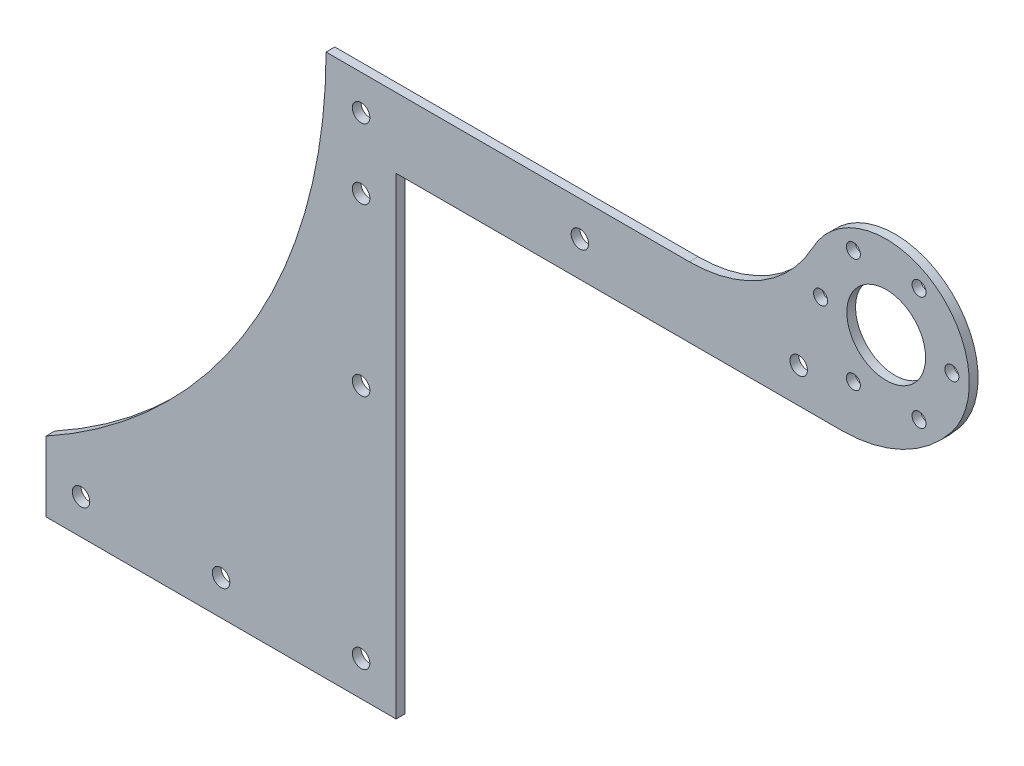
ISO-10303-21;
HEADER;
FILE_DESCRIPTION(('STEP AP214'),'2;1');
FILE_NAME('part.step','',(''),(''),'','','');
FILE_SCHEMA(('AUTOMOTIVE_DESIGN { 1 0 10303 214 1 1 1 1 }'));
ENDSEC;
DATA;
#1=APPLICATION_CONTEXT('core data for automotive mechanical design processes');
#2=APPLICATION_PROTOCOL_DEFINITION('international standard','automotive_design',2000,#1);
#3=PRODUCT_CONTEXT('',#1,'mechanical');
#4=PRODUCT('Part','Part','',(#3));
#5=PRODUCT_RELATED_PRODUCT_CATEGORY('part','',(#4));
#6=PRODUCT_DEFINITION_FORMATION('','',#4);
#7=PRODUCT_DEFINITION_CONTEXT('part definition',#1,'design');
#8=PRODUCT_DEFINITION('design','',#6,#7);
#9=PRODUCT_DEFINITION_SHAPE('','',#8);
#10=(LENGTH_UNIT() NAMED_UNIT(*) SI_UNIT(.MILLI.,.METRE.));
#11=(NAMED_UNIT(*) PLANE_ANGLE_UNIT() SI_UNIT($,.RADIAN.));
#12=(NAMED_UNIT(*) SI_UNIT($,.STERADIAN.) SOLID_ANGLE_UNIT());
#13=UNCERTAINTY_MEASURE_WITH_UNIT(LENGTH_MEASURE(1.E-05),#10,'distance_accuracy_value','');
#14=(GEOMETRIC_REPRESENTATION_CONTEXT(3) GLOBAL_UNCERTAINTY_ASSIGNED_CONTEXT((#13)) GLOBAL_UNIT_ASSIGNED_CONTEXT((#10,
#11,#12)) REPRESENTATION_CONTEXT('',''));
#15=CARTESIAN_POINT('',(0.,0.,0.));
#16=DIRECTION('',(0.,0.,1.));
#17=DIRECTION('',(1.,0.,0.));
#18=AXIS2_PLACEMENT_3D('',#15,#16,#17);
#19=CARTESIAN_POINT('',(0.,171.45,-3.175));
#20=DIRECTION('',(1.,0.,0.));
#21=DIRECTION('',(0.,1.,0.));
#22=AXIS2_PLACEMENT_3D('',#19,#20,#21);
#23=PLANE('',#22);
#24=DIRECTION('',(0.,1.,0.));
#25=VECTOR('',#24,1.);
#26=CARTESIAN_POINT('',(0.,171.45,0.));
#27=LINE('',#26,#25);
#28=CARTESIAN_POINT('',(0.,0.,0.));
#29=VERTEX_POINT('',#28);
#30=CARTESIAN_POINT('',(0.,171.45,0.));
#31=VERTEX_POINT('',#30);
#32=EDGE_CURVE('E142',#29,#31,#27,.T.);
#33=ORIENTED_EDGE('',*,*,#32,.F.);
#34=DIRECTION('',(0.,0.,1.));
#35=VECTOR('',#34,1.);
#36=CARTESIAN_POINT('',(0.,0.,-3.175));
#37=LINE('',#36,#35);
#38=CARTESIAN_POINT('',(0.,0.,-3.175));
#39=VERTEX_POINT('',#38);
#40=EDGE_CURVE('E11',#39,#29,#37,.T.);
#41=ORIENTED_EDGE('',*,*,#40,.F.);
#42=DIRECTION('',(0.,1.,0.));
#43=VECTOR('',#42,1.);
#44=CARTESIAN_POINT('',(0.,171.45,-3.175));
#45=LINE('',#44,#43);
#46=CARTESIAN_POINT('',(0.,171.45,-3.175));
#47=VERTEX_POINT('',#46);
#48=EDGE_CURVE('E166',#39,#47,#45,.T.);
#49=ORIENTED_EDGE('',*,*,#48,.T.);
#50=DIRECTION('',(0.,0.,1.));
#51=VECTOR('',#50,1.);
#52=CARTESIAN_POINT('',(0.,171.45,-3.175));
#53=LINE('',#52,#51);
#54=EDGE_CURVE('E42',#47,#31,#53,.T.);
#55=ORIENTED_EDGE('',*,*,#54,.T.);
#56=EDGE_LOOP('',(#33,#41,#49,#55));
#57=FACE_BOUND('',#56,.T.);
#58=ADVANCED_FACE('F39',(#57),#23,.T.);
#59=CARTESIAN_POINT('',(0.,0.,-3.175));
#60=DIRECTION('',(0.,-1.,0.));
#61=DIRECTION('',(1.,0.,0.));
#62=AXIS2_PLACEMENT_3D('',#59,#60,#61);
#63=PLANE('',#62);
#64=DIRECTION('',(1.,0.,0.));
#65=VECTOR('',#64,1.);
#66=CARTESIAN_POINT('',(0.,0.,0.));
#67=LINE('',#66,#65);
#68=CARTESIAN_POINT('',(-127.,0.,0.));
#69=VERTEX_POINT('',#68);
#70=EDGE_CURVE('E164',#69,#29,#67,.T.);
#71=ORIENTED_EDGE('',*,*,#70,.F.);
#72=DIRECTION('',(0.,0.,1.));
#73=VECTOR('',#72,1.);
#74=CARTESIAN_POINT('',(-127.,0.,-3.175));
#75=LINE('',#74,#73);
#76=CARTESIAN_POINT('',(-127.,0.,-3.175));
#77=VERTEX_POINT('',#76);
#78=EDGE_CURVE('E48',#77,#69,#75,.T.);
#79=ORIENTED_EDGE('',*,*,#78,.F.);
#80=DIRECTION('',(1.,0.,0.));
#81=VECTOR('',#80,1.);
#82=CARTESIAN_POINT('',(0.,0.,-3.175));
#83=LINE('',#82,#81);
#84=EDGE_CURVE('E131',#77,#39,#83,.T.);
#85=ORIENTED_EDGE('',*,*,#84,.T.);
#86=ORIENTED_EDGE('',*,*,#40,.T.);
#87=EDGE_LOOP('',(#71,#79,#85,#86));
#88=FACE_BOUND('',#87,.T.);
#89=ADVANCED_FACE('F181',(#88),#63,.T.);
#90=CARTESIAN_POINT('',(-127.,0.,-3.175));
#91=DIRECTION('',(-1.,0.,0.));
#92=DIRECTION('',(0.,-1.,0.));
#93=AXIS2_PLACEMENT_3D('',#90,#91,#92);
#94=PLANE('',#93);
#95=DIRECTION('',(0.,-1.,0.));
#96=VECTOR('',#95,1.);
#97=CARTESIAN_POINT('',(-127.,0.,0.));
#98=LINE('',#97,#96);
#99=CARTESIAN_POINT('',(-127.,25.4,0.));
#100=VERTEX_POINT('',#99);
#101=EDGE_CURVE('E119',#100,#69,#98,.T.);
#102=ORIENTED_EDGE('',*,*,#101,.F.);
#103=DIRECTION('',(0.,0.,1.));
#104=VECTOR('',#103,1.);
#105=CARTESIAN_POINT('',(-127.,25.4,-3.175));
#106=LINE('',#105,#104);
#107=CARTESIAN_POINT('',(-127.,25.4,-3.175));
#108=VERTEX_POINT('',#107);
#109=EDGE_CURVE('E114',#108,#100,#106,.T.);
#110=ORIENTED_EDGE('',*,*,#109,.F.);
#111=DIRECTION('',(0.,-1.,0.));
#112=VECTOR('',#111,1.);
#113=CARTESIAN_POINT('',(-127.,0.,-3.175));
#114=LINE('',#113,#112);
#115=EDGE_CURVE('E117',#108,#77,#114,.T.);
#116=ORIENTED_EDGE('',*,*,#115,.T.);
#117=ORIENTED_EDGE('',*,*,#78,.T.);
#118=EDGE_LOOP('',(#102,#110,#116,#117));
#119=FACE_BOUND('',#118,.T.);
#120=ADVANCED_FACE('F116',(#119),#94,.T.);
#121=CARTESIAN_POINT('',(-220.8609375,196.85,-3.175));
#122=DIRECTION('',(0.,0.,1.));
#123=DIRECTION('',(1.,0.,0.));
#124=AXIS2_PLACEMENT_3D('',#121,#122,#123);
#125=CYLINDRICAL_SURFACE('',#124,195.4609375);
#126=CARTESIAN_POINT('',(-220.8609375,196.85,0.));
#127=DIRECTION('',(0.,0.,-1.));
#128=DIRECTION('',(-1.,0.,0.));
#129=AXIS2_PLACEMENT_3D('',#126,#127,#128);
#130=CIRCLE('',#129,195.4609375);
#131=CARTESIAN_POINT('',(-25.4,196.85,0.));
#132=VERTEX_POINT('',#131);
#133=EDGE_CURVE('E161',#132,#100,#130,.T.);
#134=ORIENTED_EDGE('',*,*,#133,.F.);
#135=DIRECTION('',(0.,0.,1.));
#136=VECTOR('',#135,1.);
#137=CARTESIAN_POINT('',(-25.4,196.85,-3.175));
#138=LINE('',#137,#136);
#139=CARTESIAN_POINT('',(-25.4,196.85,-3.175));
#140=VERTEX_POINT('',#139);
#141=EDGE_CURVE('E124',#140,#132,#138,.T.);
#142=ORIENTED_EDGE('',*,*,#141,.F.);
#143=CARTESIAN_POINT('',(-220.8609375,196.85,-3.175));
#144=DIRECTION('',(0.,0.,-1.));
#145=DIRECTION('',(-1.,0.,0.));
#146=AXIS2_PLACEMENT_3D('',#143,#144,#145);
#147=CIRCLE('',#146,195.4609375);
#148=EDGE_CURVE('E130',#140,#108,#147,.T.);
#149=ORIENTED_EDGE('',*,*,#148,.T.);
#150=ORIENTED_EDGE('',*,*,#109,.T.);
#151=EDGE_LOOP('',(#134,#142,#149,#150));
#152=FACE_BOUND('',#151,.T.);
#153=ADVANCED_FACE('F134',(#152),#125,.F.);
#154=CARTESIAN_POINT('',(-25.4,196.85,-3.175));
#155=DIRECTION('',(0.,1.,0.));
#156=DIRECTION('',(0.,0.,1.));
#157=AXIS2_PLACEMENT_3D('',#154,#155,#156);
#158=PLANE('',#157);
#159=DIRECTION('',(-1.,0.,0.));
#160=VECTOR('',#159,1.);
#161=CARTESIAN_POINT('',(-25.4,196.85,0.));
#162=LINE('',#161,#160);
#163=CARTESIAN_POINT('',(106.3625,196.85,0.));
#164=VERTEX_POINT('',#163);
#165=EDGE_CURVE('E158',#164,#132,#162,.T.);
#166=ORIENTED_EDGE('',*,*,#165,.F.);
#167=DIRECTION('',(0.,0.,1.));
#168=VECTOR('',#167,1.);
#169=CARTESIAN_POINT('',(106.3625,196.85,-3.175));
#170=LINE('',#169,#168);
#171=CARTESIAN_POINT('',(106.3625,196.85,-3.175));
#172=VERTEX_POINT('',#171);
#173=EDGE_CURVE('E170',#172,#164,#170,.T.);
#174=ORIENTED_EDGE('',*,*,#173,.F.);
#175=DIRECTION('',(-1.,0.,0.));
#176=VECTOR('',#175,1.);
#177=CARTESIAN_POINT('',(0.,196.85,-3.175));
#178=LINE('',#177,#176);
#179=EDGE_CURVE('E135',#172,#140,#178,.T.);
#180=ORIENTED_EDGE('',*,*,#179,.T.);
#181=ORIENTED_EDGE('',*,*,#141,.T.);
#182=EDGE_LOOP('',(#166,#174,#180,#181));
#183=FACE_BOUND('',#182,.T.);
#184=ADVANCED_FACE('F194',(#183),#158,.T.);
#185=CARTESIAN_POINT('',(106.3625,247.65,-3.175));
#186=DIRECTION('',(0.,0.,1.));
#187=DIRECTION('',(1.,0.,0.));
#188=AXIS2_PLACEMENT_3D('',#185,#186,#187);
#189=CYLINDRICAL_SURFACE('',#188,50.8);
#190=CARTESIAN_POINT('',(106.3625,247.65,0.));
#191=DIRECTION('',(0.,0.,-1.));
#192=DIRECTION('',(1.,0.,0.));
#193=AXIS2_PLACEMENT_3D('',#190,#191,#192);
#194=CIRCLE('',#193,50.8);
#195=CARTESIAN_POINT('',(151.186029411765,223.744117647059,0.));
#196=VERTEX_POINT('',#195);
#197=EDGE_CURVE('E155',#196,#164,#194,.T.);
#198=ORIENTED_EDGE('',*,*,#197,.F.);
#199=DIRECTION('',(0.,0.,1.));
#200=VECTOR('',#199,1.);
#201=CARTESIAN_POINT('',(151.186029411765,223.744117647059,-3.175));
#202=LINE('',#201,#200);
#203=CARTESIAN_POINT('',(151.186029411765,223.744117647059,-3.175));
#204=VERTEX_POINT('',#203);
#205=EDGE_CURVE('E173',#204,#196,#202,.T.);
#206=ORIENTED_EDGE('',*,*,#205,.F.);
#207=CARTESIAN_POINT('',(106.3625,247.65,-3.175));
#208=DIRECTION('',(0.,0.,-1.));
#209=DIRECTION('',(1.,0.,0.));
#210=AXIS2_PLACEMENT_3D('',#207,#208,#209);
#211=CIRCLE('',#210,50.8);
#212=EDGE_CURVE('E137',#204,#172,#211,.T.);
#213=ORIENTED_EDGE('',*,*,#212,.T.);
#214=ORIENTED_EDGE('',*,*,#173,.T.);
#215=EDGE_LOOP('',(#198,#206,#213,#214));
#216=FACE_BOUND('',#215,.T.);
#217=ADVANCED_FACE('F197',(#216),#189,.F.);
#218=CARTESIAN_POINT('',(177.8,209.55,-3.175));
#219=DIRECTION('',(0.,0.,1.));
#220=DIRECTION('',(1.,0.,0.));
#221=AXIS2_PLACEMENT_3D('',#218,#219,#220);
#222=CYLINDRICAL_SURFACE('',#221,30.1625);
#223=CARTESIAN_POINT('',(177.8,209.55,0.));
#224=DIRECTION('',(0.,0.,1.));
#225=DIRECTION('',(1.,0.,0.));
#226=AXIS2_PLACEMENT_3D('',#223,#224,#225);
#227=CIRCLE('',#226,30.1625);
#228=CARTESIAN_POINT('',(201.574896344481,190.988461538462,0.));
#229=VERTEX_POINT('',#228);
#230=EDGE_CURVE('E152',#229,#196,#227,.T.);
#231=ORIENTED_EDGE('',*,*,#230,.F.);
#232=DIRECTION('',(0.,0.,1.));
#233=VECTOR('',#232,1.);
#234=CARTESIAN_POINT('',(201.574896344481,190.988461538462,-3.175));
#235=LINE('',#234,#233);
#236=CARTESIAN_POINT('',(201.574896344481,190.988461538462,-3.175));
#237=VERTEX_POINT('',#236);
#238=EDGE_CURVE('E175',#237,#229,#235,.T.);
#239=ORIENTED_EDGE('',*,*,#238,.F.);
#240=CARTESIAN_POINT('',(177.8,209.55,-3.175));
#241=DIRECTION('',(0.,0.,1.));
#242=DIRECTION('',(1.,0.,0.));
#243=AXIS2_PLACEMENT_3D('',#240,#241,#242);
#244=CIRCLE('',#243,30.1625);
#245=EDGE_CURVE('E380',#237,#204,#244,.T.);
#246=ORIENTED_EDGE('',*,*,#245,.T.);
#247=ORIENTED_EDGE('',*,*,#205,.T.);
#248=EDGE_LOOP('',(#231,#239,#246,#247));
#249=FACE_BOUND('',#248,.T.);
#250=ADVANCED_FACE('F201',(#249),#222,.T.);
#251=CARTESIAN_POINT('',(161.532965659039,222.25,-3.175));
#252=DIRECTION('',(0.,0.,1.));
#253=DIRECTION('',(1.,0.,0.));
#254=AXIS2_PLACEMENT_3D('',#251,#252,#253);
#255=CYLINDRICAL_SURFACE('',#254,50.8);
#256=CARTESIAN_POINT('',(161.532965659039,222.25,0.));
#257=DIRECTION('',(0.,0.,1.));
#258=DIRECTION('',(-1.,0.,0.));
#259=AXIS2_PLACEMENT_3D('',#256,#257,#258);
#260=CIRCLE('',#259,50.8);
#261=CARTESIAN_POINT('',(161.532965659039,171.45,0.));
#262=VERTEX_POINT('',#261);
#263=EDGE_CURVE('E149',#262,#229,#260,.T.);
#264=ORIENTED_EDGE('',*,*,#263,.F.);
#265=DIRECTION('',(0.,0.,1.));
#266=VECTOR('',#265,1.);
#267=CARTESIAN_POINT('',(161.532965659039,171.45,-3.175));
#268=LINE('',#267,#266);
#269=CARTESIAN_POINT('',(161.532965659039,171.45,-3.175));
#270=VERTEX_POINT('',#269);
#271=EDGE_CURVE('E176',#270,#262,#268,.T.);
#272=ORIENTED_EDGE('',*,*,#271,.F.);
#273=CARTESIAN_POINT('',(161.532965659039,222.25,-3.175));
#274=DIRECTION('',(0.,0.,1.));
#275=DIRECTION('',(-1.,0.,0.));
#276=AXIS2_PLACEMENT_3D('',#273,#274,#275);
#277=CIRCLE('',#276,50.8);
#278=EDGE_CURVE('E377',#270,#237,#277,.T.);
#279=ORIENTED_EDGE('',*,*,#278,.T.);
#280=ORIENTED_EDGE('',*,*,#238,.T.);
#281=EDGE_LOOP('',(#264,#272,#279,#280));
#282=FACE_BOUND('',#281,.T.);
#283=ADVANCED_FACE('F205',(#282),#255,.T.);
#284=CARTESIAN_POINT('',(161.532965659039,171.45,-3.175));
#285=DIRECTION('',(0.,-1.,0.));
#286=DIRECTION('',(1.,0.,0.));
#287=AXIS2_PLACEMENT_3D('',#284,#285,#286);
#288=PLANE('',#287);
#289=DIRECTION('',(1.,0.,0.));
#290=VECTOR('',#289,1.);
#291=CARTESIAN_POINT('',(161.532965659039,171.45,0.));
#292=LINE('',#291,#290);
#293=EDGE_CURVE('E145',#31,#262,#292,.T.);
#294=ORIENTED_EDGE('',*,*,#293,.F.);
#295=ORIENTED_EDGE('',*,*,#54,.F.);
#296=DIRECTION('',(1.,0.,0.));
#297=VECTOR('',#296,1.);
#298=CARTESIAN_POINT('',(161.532965659039,171.45,-3.175));
#299=LINE('',#298,#297);
#300=EDGE_CURVE('E375',#47,#270,#299,.T.);
#301=ORIENTED_EDGE('',*,*,#300,.T.);
#302=ORIENTED_EDGE('',*,*,#271,.T.);
#303=EDGE_LOOP('',(#294,#295,#301,#302));
#304=FACE_BOUND('',#303,.T.);
#305=ADVANCED_FACE('F178',(#304),#288,.T.);
#306=CARTESIAN_POINT('',(-220.8609375,196.85,-3.175));
#307=DIRECTION('',(0.,0.,-1.));
#308=DIRECTION('',(-1.,0.,0.));
#309=AXIS2_PLACEMENT_3D('',#306,#307,#308);
#310=PLANE('',#309);
#311=CARTESIAN_POINT('',(-12.7,158.75,-3.175));
#312=DIRECTION('',(0.,0.,1.));
#313=DIRECTION('',(1.,0.,0.));
#314=AXIS2_PLACEMENT_3D('',#311,#312,#313);
#315=CIRCLE('',#314,3.175);
#316=CARTESIAN_POINT('',(-9.525,158.75,-3.175));
#317=VERTEX_POINT('',#316);
#318=EDGE_CURVE('E284',#317,#317,#315,.T.);
#319=ORIENTED_EDGE('',*,*,#318,.T.);
#320=EDGE_LOOP('',(#319));
#321=FACE_BOUND('',#320,.T.);
#322=CARTESIAN_POINT('',(66.675,184.15,-3.175));
#323=DIRECTION('',(0.,0.,1.));
#324=DIRECTION('',(1.,0.,0.));
#325=AXIS2_PLACEMENT_3D('',#322,#323,#324);
#326=CIRCLE('',#325,3.175);
#327=CARTESIAN_POINT('',(69.85,184.15,-3.175));
#328=VERTEX_POINT('',#327);
#329=EDGE_CURVE('E292',#328,#328,#326,.T.);
#330=ORIENTED_EDGE('',*,*,#329,.T.);
#331=EDGE_LOOP('',(#330));
#332=FACE_BOUND('',#331,.T.);
#333=CARTESIAN_POINT('',(189.70625,230.172229927617,-3.175));
#334=DIRECTION('',(0.,0.,1.));
#335=DIRECTION('',(1.,0.,0.));
#336=AXIS2_PLACEMENT_3D('',#333,#334,#335);
#337=CIRCLE('',#336,2.53999999999988);
#338=CARTESIAN_POINT('',(192.24625,230.172229927617,-3.175));
#339=VERTEX_POINT('',#338);
#340=EDGE_CURVE('E298',#339,#339,#337,.T.);
#341=ORIENTED_EDGE('',*,*,#340,.T.);
#342=EDGE_LOOP('',(#341));
#343=FACE_BOUND('',#342,.T.);
#344=CARTESIAN_POINT('',(165.89375,230.172229927617,-3.175));
#345=DIRECTION('',(0.,0.,1.));
#346=DIRECTION('',(1.,0.,0.));
#347=AXIS2_PLACEMENT_3D('',#344,#345,#346);
#348=CIRCLE('',#347,2.53999999999992);
#349=CARTESIAN_POINT('',(168.43375,230.172229927617,-3.175));
#350=VERTEX_POINT('',#349);
#351=EDGE_CURVE('E304',#350,#350,#348,.T.);
#352=ORIENTED_EDGE('',*,*,#351,.T.);
#353=EDGE_LOOP('',(#352));
#354=FACE_BOUND('',#353,.T.);
#355=CARTESIAN_POINT('',(153.9875,209.55,-3.175));
#356=DIRECTION('',(0.,0.,1.));
#357=DIRECTION('',(1.,0.,0.));
#358=AXIS2_PLACEMENT_3D('',#355,#356,#357);
#359=CIRCLE('',#358,2.54000000000007);
#360=CARTESIAN_POINT('',(156.5275,209.55,-3.175));
#361=VERTEX_POINT('',#360);
#362=EDGE_CURVE('E310',#361,#361,#359,.T.);
#363=ORIENTED_EDGE('',*,*,#362,.T.);
#364=EDGE_LOOP('',(#363));
#365=FACE_BOUND('',#364,.T.);
#366=CARTESIAN_POINT('',(165.89375,188.927770072383,-3.175));
#367=DIRECTION('',(0.,0.,1.));
#368=DIRECTION('',(1.,0.,0.));
#369=AXIS2_PLACEMENT_3D('',#366,#367,#368);
#370=CIRCLE('',#369,2.53999999999995);
#371=CARTESIAN_POINT('',(168.43375,188.927770072383,-3.175));
#372=VERTEX_POINT('',#371);
#373=EDGE_CURVE('E316',#372,#372,#370,.T.);
#374=ORIENTED_EDGE('',*,*,#373,.T.);
#375=EDGE_LOOP('',(#374));
#376=FACE_BOUND('',#375,.T.);
#377=CARTESIAN_POINT('',(189.70625,188.927770072383,-3.175));
#378=DIRECTION('',(0.,0.,1.));
#379=DIRECTION('',(1.,0.,0.));
#380=AXIS2_PLACEMENT_3D('',#377,#378,#379);
#381=CIRCLE('',#380,2.54000000000008);
#382=CARTESIAN_POINT('',(192.24625,188.927770072383,-3.175));
#383=VERTEX_POINT('',#382);
#384=EDGE_CURVE('E322',#383,#383,#381,.T.);
#385=ORIENTED_EDGE('',*,*,#384,.T.);
#386=EDGE_LOOP('',(#385));
#387=FACE_BOUND('',#386,.T.);
#388=CARTESIAN_POINT('',(177.8,209.55,-3.175));
#389=DIRECTION('',(0.,0.,1.));
#390=DIRECTION('',(1.,0.,0.));
#391=AXIS2_PLACEMENT_3D('',#388,#389,#390);
#392=CIRCLE('',#391,14.2875);
#393=CARTESIAN_POINT('',(192.0875,209.55,-3.175));
#394=VERTEX_POINT('',#393);
#395=EDGE_CURVE('E328',#394,#394,#392,.T.);
#396=ORIENTED_EDGE('',*,*,#395,.T.);
#397=EDGE_LOOP('',(#396));
#398=FACE_BOUND('',#397,.T.);
#399=CARTESIAN_POINT('',(201.6125,209.55,-3.175));
#400=DIRECTION('',(0.,0.,1.));
#401=DIRECTION('',(1.,0.,0.));
#402=AXIS2_PLACEMENT_3D('',#399,#400,#401);
#403=CIRCLE('',#402,2.54000000000001);
#404=CARTESIAN_POINT('',(204.1525,209.55,-3.175));
#405=VERTEX_POINT('',#404);
#406=EDGE_CURVE('E334',#405,#405,#403,.T.);
#407=ORIENTED_EDGE('',*,*,#406,.T.);
#408=EDGE_LOOP('',(#407));
#409=FACE_BOUND('',#408,.T.);
#410=CARTESIAN_POINT('',(146.05,184.15,-3.175));
#411=DIRECTION('',(0.,0.,1.));
#412=DIRECTION('',(1.,0.,0.));
#413=AXIS2_PLACEMENT_3D('',#410,#411,#412);
#414=CIRCLE('',#413,3.17499999999997);
#415=CARTESIAN_POINT('',(149.225,184.15,-3.175));
#416=VERTEX_POINT('',#415);
#417=EDGE_CURVE('E340',#416,#416,#414,.T.);
#418=ORIENTED_EDGE('',*,*,#417,.T.);
#419=EDGE_LOOP('',(#418));
#420=FACE_BOUND('',#419,.T.);
#421=CARTESIAN_POINT('',(-12.7,98.425,-3.175));
#422=DIRECTION('',(0.,0.,1.));
#423=DIRECTION('',(1.,0.,0.));
#424=AXIS2_PLACEMENT_3D('',#421,#422,#423);
#425=CIRCLE('',#424,3.175);
#426=CARTESIAN_POINT('',(-9.52499999999998,98.425,-3.175));
#427=VERTEX_POINT('',#426);
#428=EDGE_CURVE('E346',#427,#427,#425,.T.);
#429=ORIENTED_EDGE('',*,*,#428,.T.);
#430=EDGE_LOOP('',(#429));
#431=FACE_BOUND('',#430,.T.);
#432=CARTESIAN_POINT('',(-63.5,12.7,-3.175));
#433=DIRECTION('',(0.,0.,1.));
#434=DIRECTION('',(1.,0.,0.));
#435=AXIS2_PLACEMENT_3D('',#432,#433,#434);
#436=CIRCLE('',#435,3.175);
#437=CARTESIAN_POINT('',(-60.325,12.7,-3.175));
#438=VERTEX_POINT('',#437);
#439=EDGE_CURVE('E352',#438,#438,#436,.T.);
#440=ORIENTED_EDGE('',*,*,#439,.T.);
#441=EDGE_LOOP('',(#440));
#442=FACE_BOUND('',#441,.T.);
#443=CARTESIAN_POINT('',(-114.3,12.7,-3.175));
#444=DIRECTION('',(0.,0.,1.));
#445=DIRECTION('',(1.,0.,0.));
#446=AXIS2_PLACEMENT_3D('',#443,#444,#445);
#447=CIRCLE('',#446,3.175);
#448=CARTESIAN_POINT('',(-111.125,12.7,-3.175));
#449=VERTEX_POINT('',#448);
#450=EDGE_CURVE('E358',#449,#449,#447,.T.);
#451=ORIENTED_EDGE('',*,*,#450,.T.);
#452=EDGE_LOOP('',(#451));
#453=FACE_BOUND('',#452,.T.);
#454=CARTESIAN_POINT('',(-12.7,184.15,-3.175));
#455=DIRECTION('',(0.,0.,1.));
#456=DIRECTION('',(1.,0.,0.));
#457=AXIS2_PLACEMENT_3D('',#454,#455,#456);
#458=CIRCLE('',#457,3.175);
#459=CARTESIAN_POINT('',(-9.525,184.15,-3.175));
#460=VERTEX_POINT('',#459);
#461=EDGE_CURVE('E364',#460,#460,#458,.T.);
#462=ORIENTED_EDGE('',*,*,#461,.T.);
#463=EDGE_LOOP('',(#462));
#464=FACE_BOUND('',#463,.T.);
#465=CARTESIAN_POINT('',(-12.7,12.7,-3.175));
#466=DIRECTION('',(0.,0.,1.));
#467=DIRECTION('',(1.,0.,0.));
#468=AXIS2_PLACEMENT_3D('',#465,#466,#467);
#469=CIRCLE('',#468,3.175);
#470=CARTESIAN_POINT('',(-9.52500000000002,12.7,-3.175));
#471=VERTEX_POINT('',#470);
#472=EDGE_CURVE('E146',#471,#471,#469,.T.);
#473=ORIENTED_EDGE('',*,*,#472,.T.);
#474=EDGE_LOOP('',(#473));
#475=FACE_BOUND('',#474,.T.);
#476=ORIENTED_EDGE('',*,*,#48,.F.);
#477=ORIENTED_EDGE('',*,*,#84,.F.);
#478=ORIENTED_EDGE('',*,*,#115,.F.);
#479=ORIENTED_EDGE('',*,*,#148,.F.);
#480=ORIENTED_EDGE('',*,*,#179,.F.);
#481=ORIENTED_EDGE('',*,*,#212,.F.);
#482=ORIENTED_EDGE('',*,*,#245,.F.);
#483=ORIENTED_EDGE('',*,*,#278,.F.);
#484=ORIENTED_EDGE('',*,*,#300,.F.);
#485=EDGE_LOOP('',(#476,#477,#478,#479,#480,#481,#482,#483,#484));
#486=FACE_BOUND('',#485,.T.);
#487=ADVANCED_FACE('F128',(#321,#332,#343,#354,#365,#376,#387,#398,#409,#420,#431,#442,#453,
#464,#475,#486),#310,.T.);
#488=CARTESIAN_POINT('',(-220.8609375,196.85,0.));
#489=DIRECTION('',(0.,0.,-1.));
#490=DIRECTION('',(-1.,0.,0.));
#491=AXIS2_PLACEMENT_3D('',#488,#489,#490);
#492=PLANE('',#491);
#493=CARTESIAN_POINT('',(-12.7,158.75,0.));
#494=DIRECTION('',(0.,0.,1.));
#495=DIRECTION('',(1.,0.,0.));
#496=AXIS2_PLACEMENT_3D('',#493,#494,#495);
#497=CIRCLE('',#496,3.175);
#498=CARTESIAN_POINT('',(-9.525,158.75,0.));
#499=VERTEX_POINT('',#498);
#500=EDGE_CURVE('E287',#499,#499,#497,.T.);
#501=ORIENTED_EDGE('',*,*,#500,.F.);
#502=EDGE_LOOP('',(#501));
#503=FACE_BOUND('',#502,.T.);
#504=CARTESIAN_POINT('',(66.675,184.15,0.));
#505=DIRECTION('',(0.,0.,1.));
#506=DIRECTION('',(1.,0.,0.));
#507=AXIS2_PLACEMENT_3D('',#504,#505,#506);
#508=CIRCLE('',#507,3.175);
#509=CARTESIAN_POINT('',(69.85,184.15,0.));
#510=VERTEX_POINT('',#509);
#511=EDGE_CURVE('E289',#510,#510,#508,.T.);
#512=ORIENTED_EDGE('',*,*,#511,.F.);
#513=EDGE_LOOP('',(#512));
#514=FACE_BOUND('',#513,.T.);
#515=CARTESIAN_POINT('',(189.70625,230.172229927617,0.));
#516=DIRECTION('',(0.,0.,1.));
#517=DIRECTION('',(1.,0.,0.));
#518=AXIS2_PLACEMENT_3D('',#515,#516,#517);
#519=CIRCLE('',#518,2.53999999999988);
#520=CARTESIAN_POINT('',(192.24625,230.172229927617,0.));
#521=VERTEX_POINT('',#520);
#522=EDGE_CURVE('E295',#521,#521,#519,.T.);
#523=ORIENTED_EDGE('',*,*,#522,.F.);
#524=EDGE_LOOP('',(#523));
#525=FACE_BOUND('',#524,.T.);
#526=CARTESIAN_POINT('',(165.89375,230.172229927617,0.));
#527=DIRECTION('',(0.,0.,1.));
#528=DIRECTION('',(1.,0.,0.));
#529=AXIS2_PLACEMENT_3D('',#526,#527,#528);
#530=CIRCLE('',#529,2.53999999999992);
#531=CARTESIAN_POINT('',(168.43375,230.172229927617,0.));
#532=VERTEX_POINT('',#531);
#533=EDGE_CURVE('E301',#532,#532,#530,.T.);
#534=ORIENTED_EDGE('',*,*,#533,.F.);
#535=EDGE_LOOP('',(#534));
#536=FACE_BOUND('',#535,.T.);
#537=CARTESIAN_POINT('',(153.9875,209.55,0.));
#538=DIRECTION('',(0.,0.,1.));
#539=DIRECTION('',(1.,0.,0.));
#540=AXIS2_PLACEMENT_3D('',#537,#538,#539);
#541=CIRCLE('',#540,2.54000000000007);
#542=CARTESIAN_POINT('',(156.5275,209.55,0.));
#543=VERTEX_POINT('',#542);
#544=EDGE_CURVE('E307',#543,#543,#541,.T.);
#545=ORIENTED_EDGE('',*,*,#544,.F.);
#546=EDGE_LOOP('',(#545));
#547=FACE_BOUND('',#546,.T.);
#548=CARTESIAN_POINT('',(165.89375,188.927770072383,0.));
#549=DIRECTION('',(0.,0.,1.));
#550=DIRECTION('',(1.,0.,0.));
#551=AXIS2_PLACEMENT_3D('',#548,#549,#550);
#552=CIRCLE('',#551,2.53999999999995);
#553=CARTESIAN_POINT('',(168.43375,188.927770072383,0.));
#554=VERTEX_POINT('',#553);
#555=EDGE_CURVE('E313',#554,#554,#552,.T.);
#556=ORIENTED_EDGE('',*,*,#555,.F.);
#557=EDGE_LOOP('',(#556));
#558=FACE_BOUND('',#557,.T.);
#559=CARTESIAN_POINT('',(189.70625,188.927770072383,0.));
#560=DIRECTION('',(0.,0.,1.));
#561=DIRECTION('',(1.,0.,0.));
#562=AXIS2_PLACEMENT_3D('',#559,#560,#561);
#563=CIRCLE('',#562,2.54000000000008);
#564=CARTESIAN_POINT('',(192.24625,188.927770072383,0.));
#565=VERTEX_POINT('',#564);
#566=EDGE_CURVE('E319',#565,#565,#563,.T.);
#567=ORIENTED_EDGE('',*,*,#566,.F.);
#568=EDGE_LOOP('',(#567));
#569=FACE_BOUND('',#568,.T.);
#570=CARTESIAN_POINT('',(177.8,209.55,0.));
#571=DIRECTION('',(0.,0.,1.));
#572=DIRECTION('',(1.,0.,0.));
#573=AXIS2_PLACEMENT_3D('',#570,#571,#572);
#574=CIRCLE('',#573,14.2875);
#575=CARTESIAN_POINT('',(192.0875,209.55,0.));
#576=VERTEX_POINT('',#575);
#577=EDGE_CURVE('E325',#576,#576,#574,.T.);
#578=ORIENTED_EDGE('',*,*,#577,.F.);
#579=EDGE_LOOP('',(#578));
#580=FACE_BOUND('',#579,.T.);
#581=CARTESIAN_POINT('',(201.6125,209.55,0.));
#582=DIRECTION('',(0.,0.,1.));
#583=DIRECTION('',(1.,0.,0.));
#584=AXIS2_PLACEMENT_3D('',#581,#582,#583);
#585=CIRCLE('',#584,2.54000000000001);
#586=CARTESIAN_POINT('',(204.1525,209.55,0.));
#587=VERTEX_POINT('',#586);
#588=EDGE_CURVE('E331',#587,#587,#585,.T.);
#589=ORIENTED_EDGE('',*,*,#588,.F.);
#590=EDGE_LOOP('',(#589));
#591=FACE_BOUND('',#590,.T.);
#592=CARTESIAN_POINT('',(146.05,184.15,0.));
#593=DIRECTION('',(0.,0.,1.));
#594=DIRECTION('',(1.,0.,0.));
#595=AXIS2_PLACEMENT_3D('',#592,#593,#594);
#596=CIRCLE('',#595,3.17499999999997);
#597=CARTESIAN_POINT('',(149.225,184.15,0.));
#598=VERTEX_POINT('',#597);
#599=EDGE_CURVE('E337',#598,#598,#596,.T.);
#600=ORIENTED_EDGE('',*,*,#599,.F.);
#601=EDGE_LOOP('',(#600));
#602=FACE_BOUND('',#601,.T.);
#603=CARTESIAN_POINT('',(-12.7,98.425,0.));
#604=DIRECTION('',(0.,0.,1.));
#605=DIRECTION('',(1.,0.,0.));
#606=AXIS2_PLACEMENT_3D('',#603,#604,#605);
#607=CIRCLE('',#606,3.175);
#608=CARTESIAN_POINT('',(-9.52499999999998,98.425,0.));
#609=VERTEX_POINT('',#608);
#610=EDGE_CURVE('E343',#609,#609,#607,.T.);
#611=ORIENTED_EDGE('',*,*,#610,.F.);
#612=EDGE_LOOP('',(#611));
#613=FACE_BOUND('',#612,.T.);
#614=CARTESIAN_POINT('',(-63.5,12.7,0.));
#615=DIRECTION('',(0.,0.,1.));
#616=DIRECTION('',(1.,0.,0.));
#617=AXIS2_PLACEMENT_3D('',#614,#615,#616);
#618=CIRCLE('',#617,3.175);
#619=CARTESIAN_POINT('',(-60.325,12.7,0.));
#620=VERTEX_POINT('',#619);
#621=EDGE_CURVE('E349',#620,#620,#618,.T.);
#622=ORIENTED_EDGE('',*,*,#621,.F.);
#623=EDGE_LOOP('',(#622));
#624=FACE_BOUND('',#623,.T.);
#625=CARTESIAN_POINT('',(-114.3,12.7,0.));
#626=DIRECTION('',(0.,0.,1.));
#627=DIRECTION('',(1.,0.,0.));
#628=AXIS2_PLACEMENT_3D('',#625,#626,#627);
#629=CIRCLE('',#628,3.175);
#630=CARTESIAN_POINT('',(-111.125,12.7,0.));
#631=VERTEX_POINT('',#630);
#632=EDGE_CURVE('E355',#631,#631,#629,.T.);
#633=ORIENTED_EDGE('',*,*,#632,.F.);
#634=EDGE_LOOP('',(#633));
#635=FACE_BOUND('',#634,.T.);
#636=CARTESIAN_POINT('',(-12.7,184.15,0.));
#637=DIRECTION('',(0.,0.,1.));
#638=DIRECTION('',(1.,0.,0.));
#639=AXIS2_PLACEMENT_3D('',#636,#637,#638);
#640=CIRCLE('',#639,3.175);
#641=CARTESIAN_POINT('',(-9.525,184.15,0.));
#642=VERTEX_POINT('',#641);
#643=EDGE_CURVE('E361',#642,#642,#640,.T.);
#644=ORIENTED_EDGE('',*,*,#643,.F.);
#645=EDGE_LOOP('',(#644));
#646=FACE_BOUND('',#645,.T.);
#647=CARTESIAN_POINT('',(-12.7,12.7,0.));
#648=DIRECTION('',(0.,0.,1.));
#649=DIRECTION('',(1.,0.,0.));
#650=AXIS2_PLACEMENT_3D('',#647,#648,#649);
#651=CIRCLE('',#650,3.175);
#652=CARTESIAN_POINT('',(-9.52500000000002,12.7,0.));
#653=VERTEX_POINT('',#652);
#654=EDGE_CURVE('E367',#653,#653,#651,.T.);
#655=ORIENTED_EDGE('',*,*,#654,.F.);
#656=EDGE_LOOP('',(#655));
#657=FACE_BOUND('',#656,.T.);
#658=ORIENTED_EDGE('',*,*,#32,.T.);
#659=ORIENTED_EDGE('',*,*,#293,.T.);
#660=ORIENTED_EDGE('',*,*,#263,.T.);
#661=ORIENTED_EDGE('',*,*,#230,.T.);
#662=ORIENTED_EDGE('',*,*,#197,.T.);
#663=ORIENTED_EDGE('',*,*,#165,.T.);
#664=ORIENTED_EDGE('',*,*,#133,.T.);
#665=ORIENTED_EDGE('',*,*,#101,.T.);
#666=ORIENTED_EDGE('',*,*,#70,.T.);
#667=EDGE_LOOP('',(#658,#659,#660,#661,#662,#663,#664,#665,#666));
#668=FACE_BOUND('',#667,.T.);
#669=ADVANCED_FACE('F180',(#503,#514,#525,#536,#547,#558,#569,#580,#591,#602,#613,#624,#635,
#646,#657,#668),#492,.F.);
#670=CARTESIAN_POINT('',(-12.7,12.7,-3.175));
#671=DIRECTION('',(0.,0.,1.));
#672=DIRECTION('',(1.,0.,0.));
#673=AXIS2_PLACEMENT_3D('',#670,#671,#672);
#674=CYLINDRICAL_SURFACE('',#673,3.175);
#675=ORIENTED_EDGE('',*,*,#472,.F.);
#676=EDGE_LOOP('',(#675));
#677=FACE_BOUND('',#676,.T.);
#678=ORIENTED_EDGE('',*,*,#654,.T.);
#679=EDGE_LOOP('',(#678));
#680=FACE_BOUND('',#679,.T.);
#681=ADVANCED_FACE('F217',(#677,#680),#674,.F.);
#682=CARTESIAN_POINT('',(-12.7,184.15,-3.175));
#683=DIRECTION('',(0.,0.,1.));
#684=DIRECTION('',(1.,0.,0.));
#685=AXIS2_PLACEMENT_3D('',#682,#683,#684);
#686=CYLINDRICAL_SURFACE('',#685,3.175);
#687=ORIENTED_EDGE('',*,*,#461,.F.);
#688=EDGE_LOOP('',(#687));
#689=FACE_BOUND('',#688,.T.);
#690=ORIENTED_EDGE('',*,*,#643,.T.);
#691=EDGE_LOOP('',(#690));
#692=FACE_BOUND('',#691,.T.);
#693=ADVANCED_FACE('F224',(#689,#692),#686,.F.);
#694=CARTESIAN_POINT('',(-114.3,12.7,-3.175));
#695=DIRECTION('',(0.,0.,1.));
#696=DIRECTION('',(1.,0.,0.));
#697=AXIS2_PLACEMENT_3D('',#694,#695,#696);
#698=CYLINDRICAL_SURFACE('',#697,3.175);
#699=ORIENTED_EDGE('',*,*,#450,.F.);
#700=EDGE_LOOP('',(#699));
#701=FACE_BOUND('',#700,.T.);
#702=ORIENTED_EDGE('',*,*,#632,.T.);
#703=EDGE_LOOP('',(#702));
#704=FACE_BOUND('',#703,.T.);
#705=ADVANCED_FACE('F228',(#701,#704),#698,.F.);
#706=CARTESIAN_POINT('',(-63.5,12.7,-3.175));
#707=DIRECTION('',(0.,0.,1.));
#708=DIRECTION('',(1.,0.,0.));
#709=AXIS2_PLACEMENT_3D('',#706,#707,#708);
#710=CYLINDRICAL_SURFACE('',#709,3.175);
#711=ORIENTED_EDGE('',*,*,#439,.F.);
#712=EDGE_LOOP('',(#711));
#713=FACE_BOUND('',#712,.T.);
#714=ORIENTED_EDGE('',*,*,#621,.T.);
#715=EDGE_LOOP('',(#714));
#716=FACE_BOUND('',#715,.T.);
#717=ADVANCED_FACE('F232',(#713,#716),#710,.F.);
#718=CARTESIAN_POINT('',(-12.7,98.425,-3.175));
#719=DIRECTION('',(0.,0.,1.));
#720=DIRECTION('',(1.,0.,0.));
#721=AXIS2_PLACEMENT_3D('',#718,#719,#720);
#722=CYLINDRICAL_SURFACE('',#721,3.175);
#723=ORIENTED_EDGE('',*,*,#428,.F.);
#724=EDGE_LOOP('',(#723));
#725=FACE_BOUND('',#724,.T.);
#726=ORIENTED_EDGE('',*,*,#610,.T.);
#727=EDGE_LOOP('',(#726));
#728=FACE_BOUND('',#727,.T.);
#729=ADVANCED_FACE('F236',(#725,#728),#722,.F.);
#730=CARTESIAN_POINT('',(146.05,184.15,-3.175));
#731=DIRECTION('',(0.,0.,1.));
#732=DIRECTION('',(1.,0.,0.));
#733=AXIS2_PLACEMENT_3D('',#730,#731,#732);
#734=CYLINDRICAL_SURFACE('',#733,3.17499999999997);
#735=ORIENTED_EDGE('',*,*,#417,.F.);
#736=EDGE_LOOP('',(#735));
#737=FACE_BOUND('',#736,.T.);
#738=ORIENTED_EDGE('',*,*,#599,.T.);
#739=EDGE_LOOP('',(#738));
#740=FACE_BOUND('',#739,.T.);
#741=ADVANCED_FACE('F240',(#737,#740),#734,.F.);
#742=CARTESIAN_POINT('',(201.6125,209.55,-3.175));
#743=DIRECTION('',(0.,0.,1.));
#744=DIRECTION('',(1.,0.,0.));
#745=AXIS2_PLACEMENT_3D('',#742,#743,#744);
#746=CYLINDRICAL_SURFACE('',#745,2.54000000000001);
#747=ORIENTED_EDGE('',*,*,#406,.F.);
#748=EDGE_LOOP('',(#747));
#749=FACE_BOUND('',#748,.T.);
#750=ORIENTED_EDGE('',*,*,#588,.T.);
#751=EDGE_LOOP('',(#750));
#752=FACE_BOUND('',#751,.T.);
#753=ADVANCED_FACE('F244',(#749,#752),#746,.F.);
#754=CARTESIAN_POINT('',(177.8,209.55,-3.175));
#755=DIRECTION('',(0.,0.,1.));
#756=DIRECTION('',(1.,0.,0.));
#757=AXIS2_PLACEMENT_3D('',#754,#755,#756);
#758=CYLINDRICAL_SURFACE('',#757,14.2875);
#759=ORIENTED_EDGE('',*,*,#395,.F.);
#760=EDGE_LOOP('',(#759));
#761=FACE_BOUND('',#760,.T.);
#762=ORIENTED_EDGE('',*,*,#577,.T.);
#763=EDGE_LOOP('',(#762));
#764=FACE_BOUND('',#763,.T.);
#765=ADVANCED_FACE('F248',(#761,#764),#758,.F.);
#766=CARTESIAN_POINT('',(189.70625,188.927770072383,-3.175));
#767=DIRECTION('',(0.,0.,1.));
#768=DIRECTION('',(1.,0.,0.));
#769=AXIS2_PLACEMENT_3D('',#766,#767,#768);
#770=CYLINDRICAL_SURFACE('',#769,2.54000000000008);
#771=ORIENTED_EDGE('',*,*,#384,.F.);
#772=EDGE_LOOP('',(#771));
#773=FACE_BOUND('',#772,.T.);
#774=ORIENTED_EDGE('',*,*,#566,.T.);
#775=EDGE_LOOP('',(#774));
#776=FACE_BOUND('',#775,.T.);
#777=ADVANCED_FACE('F252',(#773,#776),#770,.F.);
#778=CARTESIAN_POINT('',(165.89375,188.927770072383,-3.175));
#779=DIRECTION('',(0.,0.,1.));
#780=DIRECTION('',(1.,0.,0.));
#781=AXIS2_PLACEMENT_3D('',#778,#779,#780);
#782=CYLINDRICAL_SURFACE('',#781,2.53999999999995);
#783=ORIENTED_EDGE('',*,*,#373,.F.);
#784=EDGE_LOOP('',(#783));
#785=FACE_BOUND('',#784,.T.);
#786=ORIENTED_EDGE('',*,*,#555,.T.);
#787=EDGE_LOOP('',(#786));
#788=FACE_BOUND('',#787,.T.);
#789=ADVANCED_FACE('F256',(#785,#788),#782,.F.);
#790=CARTESIAN_POINT('',(153.9875,209.55,-3.175));
#791=DIRECTION('',(0.,0.,1.));
#792=DIRECTION('',(1.,0.,0.));
#793=AXIS2_PLACEMENT_3D('',#790,#791,#792);
#794=CYLINDRICAL_SURFACE('',#793,2.54000000000007);
#795=ORIENTED_EDGE('',*,*,#362,.F.);
#796=EDGE_LOOP('',(#795));
#797=FACE_BOUND('',#796,.T.);
#798=ORIENTED_EDGE('',*,*,#544,.T.);
#799=EDGE_LOOP('',(#798));
#800=FACE_BOUND('',#799,.T.);
#801=ADVANCED_FACE('F260',(#797,#800),#794,.F.);
#802=CARTESIAN_POINT('',(165.89375,230.172229927617,-3.175));
#803=DIRECTION('',(0.,0.,1.));
#804=DIRECTION('',(1.,0.,0.));
#805=AXIS2_PLACEMENT_3D('',#802,#803,#804);
#806=CYLINDRICAL_SURFACE('',#805,2.53999999999992);
#807=ORIENTED_EDGE('',*,*,#351,.F.);
#808=EDGE_LOOP('',(#807));
#809=FACE_BOUND('',#808,.T.);
#810=ORIENTED_EDGE('',*,*,#533,.T.);
#811=EDGE_LOOP('',(#810));
#812=FACE_BOUND('',#811,.T.);
#813=ADVANCED_FACE('F264',(#809,#812),#806,.F.);
#814=CARTESIAN_POINT('',(189.70625,230.172229927617,-3.175));
#815=DIRECTION('',(0.,0.,1.));
#816=DIRECTION('',(1.,0.,0.));
#817=AXIS2_PLACEMENT_3D('',#814,#815,#816);
#818=CYLINDRICAL_SURFACE('',#817,2.53999999999988);
#819=ORIENTED_EDGE('',*,*,#340,.F.);
#820=EDGE_LOOP('',(#819));
#821=FACE_BOUND('',#820,.T.);
#822=ORIENTED_EDGE('',*,*,#522,.T.);
#823=EDGE_LOOP('',(#822));
#824=FACE_BOUND('',#823,.T.);
#825=ADVANCED_FACE('F268',(#821,#824),#818,.F.);
#826=CARTESIAN_POINT('',(66.675,184.15,-3.175));
#827=DIRECTION('',(0.,0.,1.));
#828=DIRECTION('',(1.,0.,0.));
#829=AXIS2_PLACEMENT_3D('',#826,#827,#828);
#830=CYLINDRICAL_SURFACE('',#829,3.175);
#831=ORIENTED_EDGE('',*,*,#329,.F.);
#832=EDGE_LOOP('',(#831));
#833=FACE_BOUND('',#832,.T.);
#834=ORIENTED_EDGE('',*,*,#511,.T.);
#835=EDGE_LOOP('',(#834));
#836=FACE_BOUND('',#835,.T.);
#837=ADVANCED_FACE('F272',(#833,#836),#830,.F.);
#838=CARTESIAN_POINT('',(-12.7,158.75,-3.175));
#839=DIRECTION('',(0.,0.,1.));
#840=DIRECTION('',(1.,0.,0.));
#841=AXIS2_PLACEMENT_3D('',#838,#839,#840);
#842=CYLINDRICAL_SURFACE('',#841,3.175);
#843=ORIENTED_EDGE('',*,*,#318,.F.);
#844=EDGE_LOOP('',(#843));
#845=FACE_BOUND('',#844,.T.);
#846=ORIENTED_EDGE('',*,*,#500,.T.);
#847=EDGE_LOOP('',(#846));
#848=FACE_BOUND('',#847,.T.);
#849=ADVANCED_FACE('F276',(#845,#848),#842,.F.);
#850=CLOSED_SHELL('',(#58,#89,#120,#153,#184,#217,#250,#283,#305,#487,#669,#681,#693,#705,#717,
#729,#741,#753,#765,#777,#789,#801,#813,#825,#837,#849));
#851=MANIFOLD_SOLID_BREP('B2',#850);
#852=ADVANCED_BREP_SHAPE_REPRESENTATION('',(#18,#851),#14);
#853=SHAPE_DEFINITION_REPRESENTATION(#9,#852);
ENDSEC;
END-ISO-10303-21;
